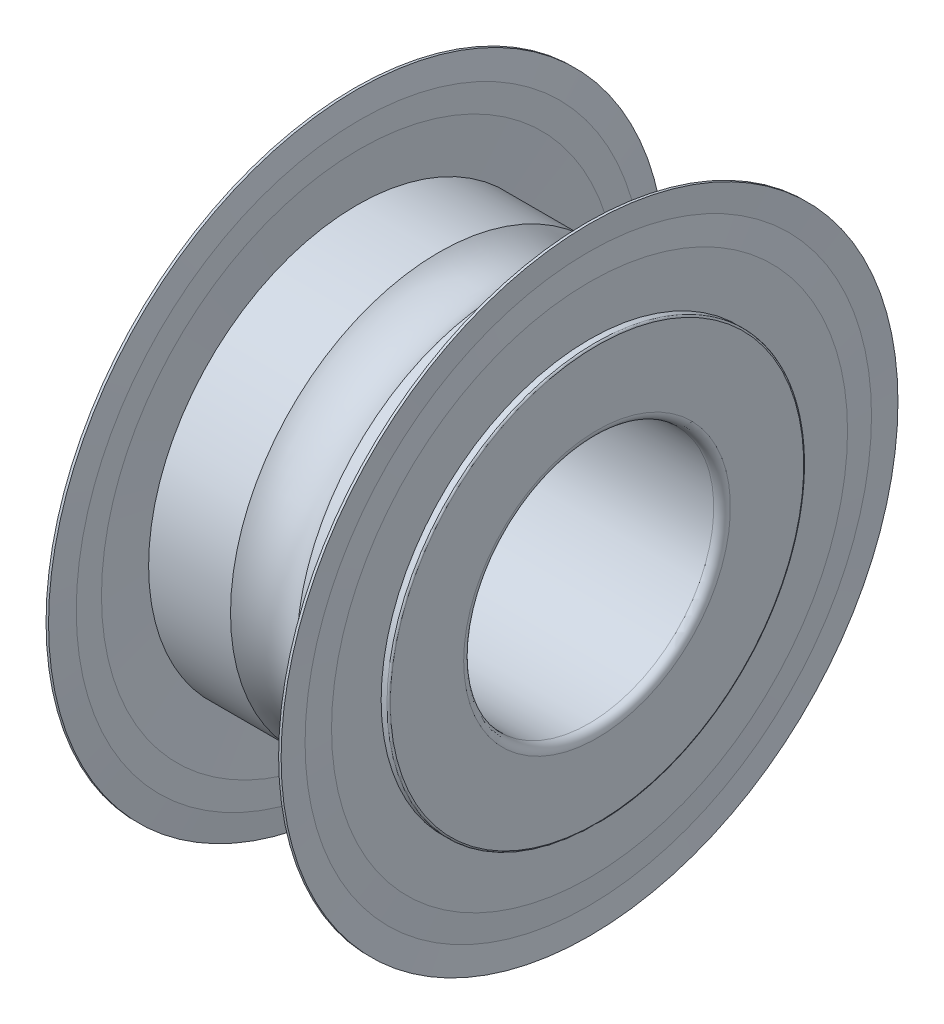
ISO-10303-21;
HEADER;
FILE_DESCRIPTION(('STEP AP214'),'2;1');
FILE_NAME('part.step','',(''),(''),'','','');
FILE_SCHEMA(('AUTOMOTIVE_DESIGN { 1 0 10303 214 1 1 1 1 }'));
ENDSEC;
DATA;
#1=APPLICATION_CONTEXT('core data for automotive mechanical design processes');
#2=APPLICATION_PROTOCOL_DEFINITION('international standard','automotive_design',2000,#1);
#3=PRODUCT_CONTEXT('',#1,'mechanical');
#4=PRODUCT('Part','Part','',(#3));
#5=PRODUCT_RELATED_PRODUCT_CATEGORY('part','',(#4));
#6=PRODUCT_DEFINITION_FORMATION('','',#4);
#7=PRODUCT_DEFINITION_CONTEXT('part definition',#1,'design');
#8=PRODUCT_DEFINITION('design','',#6,#7);
#9=PRODUCT_DEFINITION_SHAPE('','',#8);
#10=(LENGTH_UNIT() NAMED_UNIT(*) SI_UNIT(.MILLI.,.METRE.));
#11=(NAMED_UNIT(*) PLANE_ANGLE_UNIT() SI_UNIT($,.RADIAN.));
#12=(NAMED_UNIT(*) SI_UNIT($,.STERADIAN.) SOLID_ANGLE_UNIT());
#13=UNCERTAINTY_MEASURE_WITH_UNIT(LENGTH_MEASURE(1.E-05),#10,'distance_accuracy_value','');
#14=(GEOMETRIC_REPRESENTATION_CONTEXT(3) GLOBAL_UNCERTAINTY_ASSIGNED_CONTEXT((#13)) GLOBAL_UNIT_ASSIGNED_CONTEXT((#10,
#11,#12)) REPRESENTATION_CONTEXT('',''));
#15=CARTESIAN_POINT('',(0.,0.,0.));
#16=DIRECTION('',(0.,0.,1.));
#17=DIRECTION('',(1.,0.,0.));
#18=AXIS2_PLACEMENT_3D('',#15,#16,#17);
#19=CARTESIAN_POINT('',(50.,0.,0.));
#20=DIRECTION('',(-1.,0.,0.));
#21=DIRECTION('',(0.,0.,1.));
#22=AXIS2_PLACEMENT_3D('',#19,#20,#21);
#23=CYLINDRICAL_SURFACE('',#22,2.5);
#24=CARTESIAN_POINT('',(1.8968626966597,0.,0.));
#25=DIRECTION('',(-1.,0.,0.));
#26=DIRECTION('',(0.,0.,1.));
#27=AXIS2_PLACEMENT_3D('',#24,#25,#26);
#28=CIRCLE('',#27,2.5);
#29=CARTESIAN_POINT('',(1.8968626966597,0.,2.5));
#30=VERTEX_POINT('',#29);
#31=EDGE_CURVE('E72',#30,#30,#28,.T.);
#32=ORIENTED_EDGE('',*,*,#31,.F.);
#33=EDGE_LOOP('',(#32));
#34=FACE_BOUND('',#33,.T.);
#35=CARTESIAN_POINT('',(2.87950413223141,0.,0.));
#36=DIRECTION('',(-1.,0.,0.));
#37=DIRECTION('',(0.,0.,1.));
#38=AXIS2_PLACEMENT_3D('',#35,#36,#37);
#39=CIRCLE('',#38,2.5);
#40=CARTESIAN_POINT('',(2.87950413223141,0.,2.5));
#41=VERTEX_POINT('',#40);
#42=EDGE_CURVE('E10',#41,#41,#39,.F.);
#43=ORIENTED_EDGE('',*,*,#42,.F.);
#44=EDGE_LOOP('',(#43));
#45=FACE_BOUND('',#44,.T.);
#46=ADVANCED_FACE('F31',(#34,#45),#23,.T.);
#47=CARTESIAN_POINT('',(2.98,0.,0.));
#48=DIRECTION('',(-1.,0.,0.));
#49=DIRECTION('',(0.,0.,1.));
#50=AXIS2_PLACEMENT_3D('',#47,#48,#49);
#51=CIRCLE('',#50,2.5);
#52=CARTESIAN_POINT('',(2.98,0.,2.5));
#53=VERTEX_POINT('',#52);
#54=EDGE_CURVE('E69',#53,#53,#51,.T.);
#55=ORIENTED_EDGE('',*,*,#54,.T.);
#56=EDGE_LOOP('',(#55));
#57=FACE_BOUND('',#56,.T.);
#58=CARTESIAN_POINT('',(2.91,0.,0.));
#59=DIRECTION('',(-1.,0.,0.));
#60=DIRECTION('',(0.,0.,1.));
#61=AXIS2_PLACEMENT_3D('',#58,#59,#60);
#62=CIRCLE('',#61,2.5);
#63=CARTESIAN_POINT('',(2.91,0.,2.5));
#64=VERTEX_POINT('',#63);
#65=EDGE_CURVE('E38',#64,#64,#62,.T.);
#66=ORIENTED_EDGE('',*,*,#65,.F.);
#67=EDGE_LOOP('',(#66));
#68=FACE_BOUND('',#67,.T.);
#69=ADVANCED_FACE('F149',(#57,#68),#23,.T.);
#70=CARTESIAN_POINT('',(50.,0.,0.));
#71=DIRECTION('',(-1.,0.,0.));
#72=DIRECTION('',(0.,0.,1.));
#73=AXIS2_PLACEMENT_3D('',#70,#71,#72);
#74=CYLINDRICAL_SURFACE('',#73,2.5);
#75=CARTESIAN_POINT('',(0.0199999999999992,0.,0.));
#76=DIRECTION('',(-1.,0.,0.));
#77=DIRECTION('',(0.,0.,1.));
#78=AXIS2_PLACEMENT_3D('',#75,#76,#77);
#79=CIRCLE('',#78,2.5);
#80=CARTESIAN_POINT('',(0.0199999999999992,0.,2.5));
#81=VERTEX_POINT('',#80);
#82=EDGE_CURVE('E78',#81,#81,#79,.T.);
#83=ORIENTED_EDGE('',*,*,#82,.F.);
#84=EDGE_LOOP('',(#83));
#85=FACE_BOUND('',#84,.T.);
#86=CARTESIAN_POINT('',(0.0899999999999998,0.,0.));
#87=DIRECTION('',(1.,0.,0.));
#88=DIRECTION('',(0.,0.,-1.));
#89=AXIS2_PLACEMENT_3D('',#86,#87,#88);
#90=CIRCLE('',#89,2.5);
#91=CARTESIAN_POINT('',(0.0899999999999998,0.,-2.5));
#92=VERTEX_POINT('',#91);
#93=EDGE_CURVE('E42',#92,#92,#90,.T.);
#94=ORIENTED_EDGE('',*,*,#93,.F.);
#95=EDGE_LOOP('',(#94));
#96=FACE_BOUND('',#95,.T.);
#97=ADVANCED_FACE('F155',(#85,#96),#74,.T.);
#98=CARTESIAN_POINT('',(1.1031373033403,0.,0.));
#99=DIRECTION('',(-1.,0.,0.));
#100=DIRECTION('',(0.,0.,1.));
#101=AXIS2_PLACEMENT_3D('',#98,#99,#100);
#102=CIRCLE('',#101,2.5);
#103=CARTESIAN_POINT('',(1.1031373033403,0.,2.5));
#104=VERTEX_POINT('',#103);
#105=EDGE_CURVE('E75',#104,#104,#102,.T.);
#106=ORIENTED_EDGE('',*,*,#105,.T.);
#107=EDGE_LOOP('',(#106));
#108=FACE_BOUND('',#107,.T.);
#109=CARTESIAN_POINT('',(0.120495867768597,0.,0.));
#110=DIRECTION('',(1.,0.,0.));
#111=DIRECTION('',(0.,0.,-1.));
#112=AXIS2_PLACEMENT_3D('',#109,#110,#111);
#113=CIRCLE('',#112,2.5);
#114=CARTESIAN_POINT('',(0.120495867768597,0.,-2.5));
#115=VERTEX_POINT('',#114);
#116=EDGE_CURVE('E46',#115,#115,#113,.F.);
#117=ORIENTED_EDGE('',*,*,#116,.F.);
#118=EDGE_LOOP('',(#117));
#119=FACE_BOUND('',#118,.T.);
#120=ADVANCED_FACE('F188',(#108,#119),#74,.T.);
#121=CARTESIAN_POINT('',(0.0200000000000523,0.,0.));
#122=DIRECTION('',(-1.,0.,0.));
#123=DIRECTION('',(0.,0.,1.));
#124=AXIS2_PLACEMENT_3D('',#121,#122,#123);
#125=TOROIDAL_SURFACE('',#124,2.47999999999995,0.0200000000000522);
#126=CARTESIAN_POINT('',(0.,0.,0.));
#127=DIRECTION('',(-1.,0.,0.));
#128=DIRECTION('',(0.,0.,1.));
#129=AXIS2_PLACEMENT_3D('',#126,#127,#128);
#130=CIRCLE('',#129,2.48);
#131=CARTESIAN_POINT('',(0.,0.,2.48));
#132=VERTEX_POINT('',#131);
#133=EDGE_CURVE('E51',#132,#132,#130,.T.);
#134=ORIENTED_EDGE('',*,*,#133,.F.);
#135=EDGE_LOOP('',(#134));
#136=FACE_BOUND('',#135,.T.);
#137=ORIENTED_EDGE('',*,*,#82,.T.);
#138=EDGE_LOOP('',(#137));
#139=FACE_BOUND('',#138,.T.);
#140=ADVANCED_FACE('F33',(#136,#139),#125,.T.);
#141=CARTESIAN_POINT('',(0.,2.48,0.));
#142=DIRECTION('',(1.,0.,0.));
#143=DIRECTION('',(0.,0.,-1.));
#144=AXIS2_PLACEMENT_3D('',#141,#142,#143);
#145=PLANE('',#144);
#146=CARTESIAN_POINT('',(0.,0.,0.));
#147=DIRECTION('',(-1.,0.,0.));
#148=DIRECTION('',(0.,0.,1.));
#149=AXIS2_PLACEMENT_3D('',#146,#147,#148);
#150=CIRCLE('',#149,1.6);
#151=CARTESIAN_POINT('',(0.,0.,1.6));
#152=VERTEX_POINT('',#151);
#153=EDGE_CURVE('E54',#152,#152,#150,.T.);
#154=ORIENTED_EDGE('',*,*,#153,.F.);
#155=EDGE_LOOP('',(#154));
#156=FACE_BOUND('',#155,.T.);
#157=ORIENTED_EDGE('',*,*,#133,.T.);
#158=EDGE_LOOP('',(#157));
#159=FACE_BOUND('',#158,.T.);
#160=ADVANCED_FACE('F181',(#156,#159),#145,.F.);
#161=CARTESIAN_POINT('',(0.0999999999999222,0.,0.));
#162=DIRECTION('',(-1.,0.,0.));
#163=DIRECTION('',(0.,0.,1.));
#164=AXIS2_PLACEMENT_3D('',#161,#162,#163);
#165=TOROIDAL_SURFACE('',#164,1.59999999999992,0.0999999999999221);
#166=CARTESIAN_POINT('',(0.100000000000003,0.,0.));
#167=DIRECTION('',(-1.,0.,0.));
#168=DIRECTION('',(0.,0.,1.));
#169=AXIS2_PLACEMENT_3D('',#166,#167,#168);
#170=CIRCLE('',#169,1.5);
#171=CARTESIAN_POINT('',(0.100000000000003,0.,1.5));
#172=VERTEX_POINT('',#171);
#173=EDGE_CURVE('E57',#172,#172,#170,.T.);
#174=ORIENTED_EDGE('',*,*,#173,.F.);
#175=EDGE_LOOP('',(#174));
#176=FACE_BOUND('',#175,.T.);
#177=ORIENTED_EDGE('',*,*,#153,.T.);
#178=EDGE_LOOP('',(#177));
#179=FACE_BOUND('',#178,.T.);
#180=ADVANCED_FACE('F178',(#176,#179),#165,.T.);
#181=CARTESIAN_POINT('',(50.,0.,0.));
#182=DIRECTION('',(-1.,0.,0.));
#183=DIRECTION('',(0.,0.,1.));
#184=AXIS2_PLACEMENT_3D('',#181,#182,#183);
#185=CYLINDRICAL_SURFACE('',#184,1.5);
#186=CARTESIAN_POINT('',(2.9,0.,0.));
#187=DIRECTION('',(-1.,0.,0.));
#188=DIRECTION('',(0.,0.,1.));
#189=AXIS2_PLACEMENT_3D('',#186,#187,#188);
#190=CIRCLE('',#189,1.5);
#191=CARTESIAN_POINT('',(2.9,0.,1.5));
#192=VERTEX_POINT('',#191);
#193=EDGE_CURVE('E60',#192,#192,#190,.T.);
#194=ORIENTED_EDGE('',*,*,#193,.F.);
#195=EDGE_LOOP('',(#194));
#196=FACE_BOUND('',#195,.T.);
#197=ORIENTED_EDGE('',*,*,#173,.T.);
#198=EDGE_LOOP('',(#197));
#199=FACE_BOUND('',#198,.T.);
#200=ADVANCED_FACE('F174',(#196,#199),#185,.F.);
#201=CARTESIAN_POINT('',(2.90000000000015,0.,0.));
#202=DIRECTION('',(-1.,0.,0.));
#203=DIRECTION('',(0.,0.,1.));
#204=AXIS2_PLACEMENT_3D('',#201,#202,#203);
#205=TOROIDAL_SURFACE('',#204,1.59999999999985,0.0999999999998453);
#206=CARTESIAN_POINT('',(3.,0.,0.));
#207=DIRECTION('',(-1.,0.,0.));
#208=DIRECTION('',(0.,0.,1.));
#209=AXIS2_PLACEMENT_3D('',#206,#207,#208);
#210=CIRCLE('',#209,1.59999999999985);
#211=CARTESIAN_POINT('',(3.,0.,1.59999999999985));
#212=VERTEX_POINT('',#211);
#213=EDGE_CURVE('E63',#212,#212,#210,.T.);
#214=ORIENTED_EDGE('',*,*,#213,.F.);
#215=EDGE_LOOP('',(#214));
#216=FACE_BOUND('',#215,.T.);
#217=ORIENTED_EDGE('',*,*,#193,.T.);
#218=EDGE_LOOP('',(#217));
#219=FACE_BOUND('',#218,.T.);
#220=ADVANCED_FACE('F170',(#216,#219),#205,.T.);
#221=CARTESIAN_POINT('',(3.,1.6,0.));
#222=DIRECTION('',(-1.,0.,0.));
#223=DIRECTION('',(0.,0.,1.));
#224=AXIS2_PLACEMENT_3D('',#221,#222,#223);
#225=PLANE('',#224);
#226=CARTESIAN_POINT('',(3.,0.,0.));
#227=DIRECTION('',(-1.,0.,0.));
#228=DIRECTION('',(0.,0.,1.));
#229=AXIS2_PLACEMENT_3D('',#226,#227,#228);
#230=CIRCLE('',#229,2.48);
#231=CARTESIAN_POINT('',(3.,0.,2.48));
#232=VERTEX_POINT('',#231);
#233=EDGE_CURVE('E66',#232,#232,#230,.T.);
#234=ORIENTED_EDGE('',*,*,#233,.F.);
#235=EDGE_LOOP('',(#234));
#236=FACE_BOUND('',#235,.T.);
#237=ORIENTED_EDGE('',*,*,#213,.T.);
#238=EDGE_LOOP('',(#237));
#239=FACE_BOUND('',#238,.T.);
#240=ADVANCED_FACE('F166',(#236,#239),#225,.F.);
#241=CARTESIAN_POINT('',(2.97999999999989,0.,0.));
#242=DIRECTION('',(-1.,0.,0.));
#243=DIRECTION('',(0.,0.,1.));
#244=AXIS2_PLACEMENT_3D('',#241,#242,#243);
#245=TOROIDAL_SURFACE('',#244,2.4799999999999,0.0200000000001052);
#246=ORIENTED_EDGE('',*,*,#54,.F.);
#247=EDGE_LOOP('',(#246));
#248=FACE_BOUND('',#247,.T.);
#249=ORIENTED_EDGE('',*,*,#233,.T.);
#250=EDGE_LOOP('',(#249));
#251=FACE_BOUND('',#250,.T.);
#252=ADVANCED_FACE('F163',(#248,#251),#245,.T.);
#253=CARTESIAN_POINT('',(1.5,0.,0.));
#254=DIRECTION('',(-1.,0.,0.));
#255=DIRECTION('',(0.,0.,1.));
#256=AXIS2_PLACEMENT_3D('',#253,#254,#255);
#257=TOROIDAL_SURFACE('',#256,2.95000000000003,0.600000000000031);
#258=ORIENTED_EDGE('',*,*,#105,.F.);
#259=EDGE_LOOP('',(#258));
#260=FACE_BOUND('',#259,.T.);
#261=ORIENTED_EDGE('',*,*,#31,.T.);
#262=EDGE_LOOP('',(#261));
#263=FACE_BOUND('',#262,.T.);
#264=ADVANCED_FACE('F161',(#260,#263),#257,.F.);
#265=CARTESIAN_POINT('',(0.120000000000002,0.,0.));
#266=DIRECTION('',(1.,0.,0.));
#267=DIRECTION('',(0.,0.,-1.));
#268=AXIS2_PLACEMENT_3D('',#265,#266,#267);
#269=CONICAL_SURFACE('',#268,2.49,1.52125013220378);
#270=CARTESIAN_POINT('',(0.149999999999997,0.,0.));
#271=DIRECTION('',(-1.,0.,0.));
#272=DIRECTION('',(0.,0.,1.));
#273=AXIS2_PLACEMENT_3D('',#270,#271,#272);
#274=CIRCLE('',#273,3.095);
#275=CARTESIAN_POINT('',(0.149999999999997,0.,3.095));
#276=VERTEX_POINT('',#275);
#277=EDGE_CURVE('E90',#276,#276,#274,.T.);
#278=ORIENTED_EDGE('',*,*,#277,.F.);
#279=EDGE_LOOP('',(#278));
#280=FACE_BOUND('',#279,.T.);
#281=ORIENTED_EDGE('',*,*,#116,.T.);
#282=EDGE_LOOP('',(#281));
#283=FACE_BOUND('',#282,.T.);
#284=ADVANCED_FACE('F222',(#280,#283),#269,.F.);
#285=CARTESIAN_POINT('',(50.,0.,0.));
#286=DIRECTION('',(-1.,0.,0.));
#287=DIRECTION('',(0.,0.,1.));
#288=AXIS2_PLACEMENT_3D('',#285,#286,#287);
#289=CYLINDRICAL_SURFACE('',#288,3.7);
#290=CARTESIAN_POINT('',(0.0899999999999998,0.,0.));
#291=DIRECTION('',(-1.,0.,0.));
#292=DIRECTION('',(0.,0.,1.));
#293=AXIS2_PLACEMENT_3D('',#290,#291,#292);
#294=CIRCLE('',#293,3.7);
#295=CARTESIAN_POINT('',(0.0899999999999998,0.,3.7));
#296=VERTEX_POINT('',#295);
#297=EDGE_CURVE('E81',#296,#296,#294,.T.);
#298=ORIENTED_EDGE('',*,*,#297,.F.);
#299=EDGE_LOOP('',(#298));
#300=FACE_BOUND('',#299,.T.);
#301=CARTESIAN_POINT('',(0.120000000000002,0.,0.));
#302=DIRECTION('',(-1.,0.,0.));
#303=DIRECTION('',(0.,0.,1.));
#304=AXIS2_PLACEMENT_3D('',#301,#302,#303);
#305=CIRCLE('',#304,3.7);
#306=CARTESIAN_POINT('',(0.120000000000002,0.,3.7));
#307=VERTEX_POINT('',#306);
#308=EDGE_CURVE('E96',#307,#307,#305,.T.);
#309=ORIENTED_EDGE('',*,*,#308,.T.);
#310=EDGE_LOOP('',(#309));
#311=FACE_BOUND('',#310,.T.);
#312=ADVANCED_FACE('F216',(#300,#311),#289,.T.);
#313=CARTESIAN_POINT('',(0.0899999999999998,0.,0.));
#314=DIRECTION('',(-1.,0.,0.));
#315=DIRECTION('',(0.,0.,1.));
#316=AXIS2_PLACEMENT_3D('',#313,#314,#315);
#317=CONICAL_SURFACE('',#316,3.7,1.52125013220377);
#318=CARTESIAN_POINT('',(0.105000000000001,0.,0.));
#319=DIRECTION('',(-1.,0.,0.));
#320=DIRECTION('',(0.,0.,1.));
#321=AXIS2_PLACEMENT_3D('',#318,#319,#320);
#322=CIRCLE('',#321,3.3975);
#323=CARTESIAN_POINT('',(0.105000000000001,0.,3.3975));
#324=VERTEX_POINT('',#323);
#325=EDGE_CURVE('E84',#324,#324,#322,.T.);
#326=ORIENTED_EDGE('',*,*,#325,.F.);
#327=EDGE_LOOP('',(#326));
#328=FACE_BOUND('',#327,.T.);
#329=ORIENTED_EDGE('',*,*,#297,.T.);
#330=EDGE_LOOP('',(#329));
#331=FACE_BOUND('',#330,.T.);
#332=ADVANCED_FACE('F210',(#328,#331),#317,.F.);
#333=CARTESIAN_POINT('',(0.105000000000001,0.,0.));
#334=DIRECTION('',(1.,0.,0.));
#335=DIRECTION('',(0.,0.,-1.));
#336=AXIS2_PLACEMENT_3D('',#333,#334,#335);
#337=CONICAL_SURFACE('',#336,3.3975,1.52125013220377);
#338=CARTESIAN_POINT('',(0.0899999999999998,0.,0.));
#339=DIRECTION('',(-1.,0.,0.));
#340=DIRECTION('',(0.,0.,1.));
#341=AXIS2_PLACEMENT_3D('',#338,#339,#340);
#342=CIRCLE('',#341,3.095);
#343=CARTESIAN_POINT('',(0.0899999999999998,0.,3.095));
#344=VERTEX_POINT('',#343);
#345=EDGE_CURVE('E87',#344,#344,#342,.T.);
#346=ORIENTED_EDGE('',*,*,#345,.F.);
#347=EDGE_LOOP('',(#346));
#348=FACE_BOUND('',#347,.T.);
#349=ORIENTED_EDGE('',*,*,#325,.T.);
#350=EDGE_LOOP('',(#349));
#351=FACE_BOUND('',#350,.T.);
#352=ADVANCED_FACE('F204',(#348,#351),#337,.T.);
#353=CARTESIAN_POINT('',(0.09,3.095,0.));
#354=DIRECTION('',(1.,0.,0.));
#355=DIRECTION('',(0.,0.,-1.));
#356=AXIS2_PLACEMENT_3D('',#353,#354,#355);
#357=PLANE('',#356);
#358=ORIENTED_EDGE('',*,*,#93,.T.);
#359=EDGE_LOOP('',(#358));
#360=FACE_BOUND('',#359,.T.);
#361=ORIENTED_EDGE('',*,*,#345,.T.);
#362=EDGE_LOOP('',(#361));
#363=FACE_BOUND('',#362,.T.);
#364=ADVANCED_FACE('F200',(#360,#363),#357,.F.);
#365=CARTESIAN_POINT('',(0.15,3.095,0.));
#366=DIRECTION('',(-1.,0.,0.));
#367=DIRECTION('',(0.,0.,1.));
#368=AXIS2_PLACEMENT_3D('',#365,#366,#367);
#369=PLANE('',#368);
#370=CARTESIAN_POINT('',(0.149999999999997,0.,0.));
#371=DIRECTION('',(-1.,0.,0.));
#372=DIRECTION('',(0.,0.,1.));
#373=AXIS2_PLACEMENT_3D('',#370,#371,#372);
#374=CIRCLE('',#373,3.3975);
#375=CARTESIAN_POINT('',(0.149999999999997,0.,3.3975));
#376=VERTEX_POINT('',#375);
#377=EDGE_CURVE('E93',#376,#376,#374,.T.);
#378=ORIENTED_EDGE('',*,*,#377,.F.);
#379=EDGE_LOOP('',(#378));
#380=FACE_BOUND('',#379,.T.);
#381=ORIENTED_EDGE('',*,*,#277,.T.);
#382=EDGE_LOOP('',(#381));
#383=FACE_BOUND('',#382,.T.);
#384=ADVANCED_FACE('F203',(#380,#383),#369,.F.);
#385=CARTESIAN_POINT('',(0.149999999999997,0.,0.));
#386=DIRECTION('',(-1.,0.,0.));
#387=DIRECTION('',(0.,0.,1.));
#388=AXIS2_PLACEMENT_3D('',#385,#386,#387);
#389=CONICAL_SURFACE('',#388,3.3975,1.47194600472665);
#390=ORIENTED_EDGE('',*,*,#308,.F.);
#391=EDGE_LOOP('',(#390));
#392=FACE_BOUND('',#391,.T.);
#393=ORIENTED_EDGE('',*,*,#377,.T.);
#394=EDGE_LOOP('',(#393));
#395=FACE_BOUND('',#394,.T.);
#396=ADVANCED_FACE('F226',(#392,#395),#389,.T.);
#397=CARTESIAN_POINT('',(2.85,0.,0.));
#398=DIRECTION('',(-1.,0.,0.));
#399=DIRECTION('',(0.,0.,1.));
#400=AXIS2_PLACEMENT_3D('',#397,#398,#399);
#401=CONICAL_SURFACE('',#400,3.095,1.52125013220377);
#402=CARTESIAN_POINT('',(2.85,0.,0.));
#403=DIRECTION('',(-1.,0.,0.));
#404=DIRECTION('',(0.,0.,1.));
#405=AXIS2_PLACEMENT_3D('',#402,#403,#404);
#406=CIRCLE('',#405,3.095);
#407=CARTESIAN_POINT('',(2.85,0.,3.095));
#408=VERTEX_POINT('',#407);
#409=EDGE_CURVE('E102',#408,#408,#406,.T.);
#410=ORIENTED_EDGE('',*,*,#409,.T.);
#411=EDGE_LOOP('',(#410));
#412=FACE_BOUND('',#411,.T.);
#413=ORIENTED_EDGE('',*,*,#42,.T.);
#414=EDGE_LOOP('',(#413));
#415=FACE_BOUND('',#414,.T.);
#416=ADVANCED_FACE('F229',(#412,#415),#401,.F.);
#417=CARTESIAN_POINT('',(2.88,0.,0.));
#418=DIRECTION('',(1.,0.,0.));
#419=DIRECTION('',(0.,0.,-1.));
#420=AXIS2_PLACEMENT_3D('',#417,#418,#419);
#421=CONICAL_SURFACE('',#420,3.7,1.47194600472662);
#422=CARTESIAN_POINT('',(2.85,0.,0.));
#423=DIRECTION('',(-1.,0.,0.));
#424=DIRECTION('',(0.,0.,1.));
#425=AXIS2_PLACEMENT_3D('',#422,#423,#424);
#426=CIRCLE('',#425,3.3975);
#427=CARTESIAN_POINT('',(2.85,0.,3.3975));
#428=VERTEX_POINT('',#427);
#429=EDGE_CURVE('E99',#428,#428,#426,.T.);
#430=ORIENTED_EDGE('',*,*,#429,.F.);
#431=EDGE_LOOP('',(#430));
#432=FACE_BOUND('',#431,.T.);
#433=CARTESIAN_POINT('',(2.88,0.,0.));
#434=DIRECTION('',(-1.,0.,0.));
#435=DIRECTION('',(0.,0.,1.));
#436=AXIS2_PLACEMENT_3D('',#433,#434,#435);
#437=CIRCLE('',#436,3.7);
#438=CARTESIAN_POINT('',(2.88,0.,3.7));
#439=VERTEX_POINT('',#438);
#440=EDGE_CURVE('E114',#439,#439,#437,.T.);
#441=ORIENTED_EDGE('',*,*,#440,.T.);
#442=EDGE_LOOP('',(#441));
#443=FACE_BOUND('',#442,.T.);
#444=ADVANCED_FACE('F118',(#432,#443),#421,.T.);
#445=CARTESIAN_POINT('',(2.85,3.3975,0.));
#446=DIRECTION('',(1.,0.,0.));
#447=DIRECTION('',(0.,0.,-1.));
#448=AXIS2_PLACEMENT_3D('',#445,#446,#447);
#449=PLANE('',#448);
#450=ORIENTED_EDGE('',*,*,#409,.F.);
#451=EDGE_LOOP('',(#450));
#452=FACE_BOUND('',#451,.T.);
#453=ORIENTED_EDGE('',*,*,#429,.T.);
#454=EDGE_LOOP('',(#453));
#455=FACE_BOUND('',#454,.T.);
#456=ADVANCED_FACE('F140',(#452,#455),#449,.F.);
#457=CARTESIAN_POINT('',(2.91,2.49,0.));
#458=DIRECTION('',(-1.,0.,0.));
#459=DIRECTION('',(0.,0.,1.));
#460=AXIS2_PLACEMENT_3D('',#457,#458,#459);
#461=PLANE('',#460);
#462=ORIENTED_EDGE('',*,*,#65,.T.);
#463=EDGE_LOOP('',(#462));
#464=FACE_BOUND('',#463,.T.);
#465=CARTESIAN_POINT('',(2.91,0.,0.));
#466=DIRECTION('',(-1.,0.,0.));
#467=DIRECTION('',(0.,0.,1.));
#468=AXIS2_PLACEMENT_3D('',#465,#466,#467);
#469=CIRCLE('',#468,3.095);
#470=CARTESIAN_POINT('',(2.91,0.,3.095));
#471=VERTEX_POINT('',#470);
#472=EDGE_CURVE('E105',#471,#471,#469,.T.);
#473=ORIENTED_EDGE('',*,*,#472,.F.);
#474=EDGE_LOOP('',(#473));
#475=FACE_BOUND('',#474,.T.);
#476=ADVANCED_FACE('F135',(#464,#475),#461,.F.);
#477=CARTESIAN_POINT('',(2.91,0.,0.));
#478=DIRECTION('',(-1.,0.,0.));
#479=DIRECTION('',(0.,0.,1.));
#480=AXIS2_PLACEMENT_3D('',#477,#478,#479);
#481=CONICAL_SURFACE('',#480,3.095,1.52125013220377);
#482=CARTESIAN_POINT('',(2.895,0.,0.));
#483=DIRECTION('',(-1.,0.,0.));
#484=DIRECTION('',(0.,0.,1.));
#485=AXIS2_PLACEMENT_3D('',#482,#483,#484);
#486=CIRCLE('',#485,3.3975);
#487=CARTESIAN_POINT('',(2.895,0.,3.3975));
#488=VERTEX_POINT('',#487);
#489=EDGE_CURVE('E108',#488,#488,#486,.T.);
#490=ORIENTED_EDGE('',*,*,#489,.F.);
#491=EDGE_LOOP('',(#490));
#492=FACE_BOUND('',#491,.T.);
#493=ORIENTED_EDGE('',*,*,#472,.T.);
#494=EDGE_LOOP('',(#493));
#495=FACE_BOUND('',#494,.T.);
#496=ADVANCED_FACE('F129',(#492,#495),#481,.T.);
#497=CARTESIAN_POINT('',(2.895,0.,0.));
#498=DIRECTION('',(1.,0.,0.));
#499=DIRECTION('',(0.,0.,-1.));
#500=AXIS2_PLACEMENT_3D('',#497,#498,#499);
#501=CONICAL_SURFACE('',#500,3.3975,1.52125013220377);
#502=CARTESIAN_POINT('',(2.91,0.,0.));
#503=DIRECTION('',(-1.,0.,0.));
#504=DIRECTION('',(0.,0.,1.));
#505=AXIS2_PLACEMENT_3D('',#502,#503,#504);
#506=CIRCLE('',#505,3.7);
#507=CARTESIAN_POINT('',(2.91,0.,3.7));
#508=VERTEX_POINT('',#507);
#509=EDGE_CURVE('E111',#508,#508,#506,.T.);
#510=ORIENTED_EDGE('',*,*,#509,.F.);
#511=EDGE_LOOP('',(#510));
#512=FACE_BOUND('',#511,.T.);
#513=ORIENTED_EDGE('',*,*,#489,.T.);
#514=EDGE_LOOP('',(#513));
#515=FACE_BOUND('',#514,.T.);
#516=ADVANCED_FACE('F123',(#512,#515),#501,.F.);
#517=CARTESIAN_POINT('',(50.,0.,0.));
#518=DIRECTION('',(-1.,0.,0.));
#519=DIRECTION('',(0.,0.,1.));
#520=AXIS2_PLACEMENT_3D('',#517,#518,#519);
#521=CYLINDRICAL_SURFACE('',#520,3.7);
#522=ORIENTED_EDGE('',*,*,#440,.F.);
#523=EDGE_LOOP('',(#522));
#524=FACE_BOUND('',#523,.T.);
#525=ORIENTED_EDGE('',*,*,#509,.T.);
#526=EDGE_LOOP('',(#525));
#527=FACE_BOUND('',#526,.T.);
#528=ADVANCED_FACE('F120',(#524,#527),#521,.T.);
#529=CLOSED_SHELL('',(#46,#69,#97,#120,#140,#160,#180,#200,#220,#240,#252,#264,#284,#312,#332,
#352,#364,#384,#396,#416,#444,#456,#476,#496,#516,#528));
#530=MANIFOLD_SOLID_BREP('B2',#529);
#531=ADVANCED_BREP_SHAPE_REPRESENTATION('',(#18,#530),#14);
#532=SHAPE_DEFINITION_REPRESENTATION(#9,#531);
ENDSEC;
END-ISO-10303-21;
